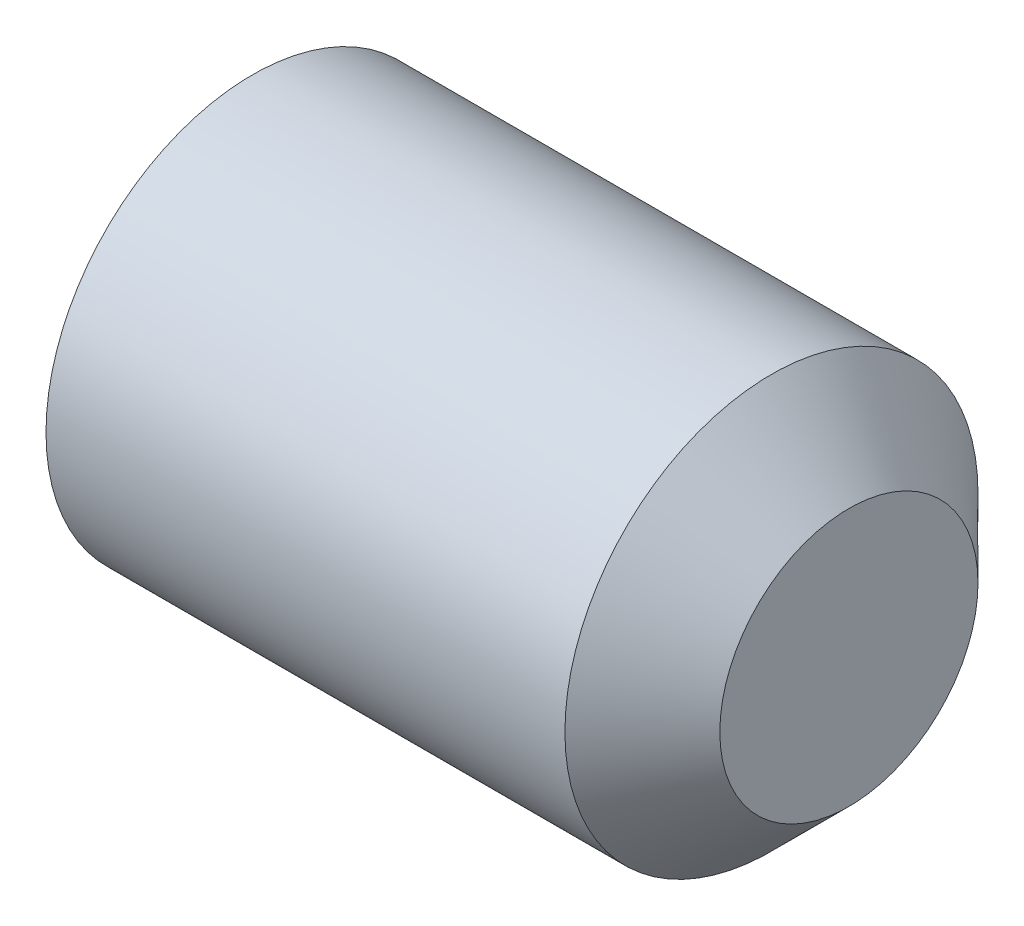
ISO-10303-21;
HEADER;
FILE_DESCRIPTION(('STEP AP214'),'2;1');
FILE_NAME('part.step','',(''),(''),'','','');
FILE_SCHEMA(('AUTOMOTIVE_DESIGN { 1 0 10303 214 1 1 1 1 }'));
ENDSEC;
DATA;
#1=APPLICATION_CONTEXT('core data for automotive mechanical design processes');
#2=APPLICATION_PROTOCOL_DEFINITION('international standard','automotive_design',2000,#1);
#3=PRODUCT_CONTEXT('',#1,'mechanical');
#4=PRODUCT('Part','Part','',(#3));
#5=PRODUCT_RELATED_PRODUCT_CATEGORY('part','',(#4));
#6=PRODUCT_DEFINITION_FORMATION('','',#4);
#7=PRODUCT_DEFINITION_CONTEXT('part definition',#1,'design');
#8=PRODUCT_DEFINITION('design','',#6,#7);
#9=PRODUCT_DEFINITION_SHAPE('','',#8);
#10=(LENGTH_UNIT() NAMED_UNIT(*) SI_UNIT(.MILLI.,.METRE.));
#11=(NAMED_UNIT(*) PLANE_ANGLE_UNIT() SI_UNIT($,.RADIAN.));
#12=(NAMED_UNIT(*) SI_UNIT($,.STERADIAN.) SOLID_ANGLE_UNIT());
#13=UNCERTAINTY_MEASURE_WITH_UNIT(LENGTH_MEASURE(1.E-05),#10,'distance_accuracy_value','');
#14=(GEOMETRIC_REPRESENTATION_CONTEXT(3) GLOBAL_UNCERTAINTY_ASSIGNED_CONTEXT((#13)) GLOBAL_UNIT_ASSIGNED_CONTEXT((#10,
#11,#12)) REPRESENTATION_CONTEXT('',''));
#15=CARTESIAN_POINT('',(0.,0.,0.));
#16=DIRECTION('',(0.,0.,1.));
#17=DIRECTION('',(1.,0.,0.));
#18=AXIS2_PLACEMENT_3D('',#15,#16,#17);
#19=CARTESIAN_POINT('',(0.,0.,0.));
#20=DIRECTION('',(-1.,0.,0.));
#21=DIRECTION('',(0.,0.,1.));
#22=AXIS2_PLACEMENT_3D('',#19,#20,#21);
#23=PLANE('',#22);
#24=CARTESIAN_POINT('',(0.,0.,0.));
#25=DIRECTION('',(-1.,0.,0.));
#26=DIRECTION('',(0.,0.,1.));
#27=AXIS2_PLACEMENT_3D('',#24,#25,#26);
#28=CIRCLE('',#27,1.61);
#29=CARTESIAN_POINT('',(0.,0.,1.61));
#30=VERTEX_POINT('',#29);
#31=EDGE_CURVE('E137',#30,#30,#28,.T.);
#32=ORIENTED_EDGE('',*,*,#31,.T.);
#33=EDGE_LOOP('',(#32));
#34=FACE_BOUND('',#33,.T.);
#35=DIRECTION('',(0.,0.,-1.));
#36=VECTOR('',#35,1.);
#37=CARTESIAN_POINT('',(0.,1.,0.577350269189623));
#38=LINE('',#37,#36);
#39=CARTESIAN_POINT('',(0.,1.,0.577350269189623));
#40=VERTEX_POINT('',#39);
#41=CARTESIAN_POINT('',(0.,1.,-0.577350269189628));
#42=VERTEX_POINT('',#41);
#43=EDGE_CURVE('E128',#40,#42,#38,.T.);
#44=ORIENTED_EDGE('',*,*,#43,.F.);
#45=DIRECTION('',(0.,-0.866025403784438,0.500000000000001));
#46=VECTOR('',#45,1.);
#47=CARTESIAN_POINT('',(0.,1.,0.577350269189623));
#48=LINE('',#47,#46);
#49=CARTESIAN_POINT('',(0.,0.,1.15470053837925));
#50=VERTEX_POINT('',#49);
#51=EDGE_CURVE('E50',#40,#50,#48,.T.);
#52=ORIENTED_EDGE('',*,*,#51,.T.);
#53=DIRECTION('',(0.,0.866025403784439,0.5));
#54=VECTOR('',#53,1.);
#55=CARTESIAN_POINT('',(0.,-0.999999999999996,0.577350269189624));
#56=LINE('',#55,#54);
#57=CARTESIAN_POINT('',(0.,-0.999999999999996,0.577350269189624));
#58=VERTEX_POINT('',#57);
#59=EDGE_CURVE('E119',#58,#50,#56,.T.);
#60=ORIENTED_EDGE('',*,*,#59,.F.);
#61=DIRECTION('',(0.,0.,-1.));
#62=VECTOR('',#61,1.);
#63=CARTESIAN_POINT('',(0.,-0.999999999999996,0.577350269189624));
#64=LINE('',#63,#62);
#65=CARTESIAN_POINT('',(0.,-0.999999999999996,-0.577350269189627));
#66=VERTEX_POINT('',#65);
#67=EDGE_CURVE('E122',#58,#66,#64,.T.);
#68=ORIENTED_EDGE('',*,*,#67,.T.);
#69=DIRECTION('',(0.,0.866025403784438,-0.500000000000001));
#70=VECTOR('',#69,1.);
#71=CARTESIAN_POINT('',(0.,-0.999999999999996,-0.577350269189627));
#72=LINE('',#71,#70);
#73=CARTESIAN_POINT('',(0.,0.,-1.15470053837925));
#74=VERTEX_POINT('',#73);
#75=EDGE_CURVE('E125',#66,#74,#72,.T.);
#76=ORIENTED_EDGE('',*,*,#75,.T.);
#77=DIRECTION('',(0.,-0.866025403784438,-0.5));
#78=VECTOR('',#77,1.);
#79=CARTESIAN_POINT('',(0.,1.,-0.577350269189628));
#80=LINE('',#79,#78);
#81=EDGE_CURVE('E108',#42,#74,#80,.T.);
#82=ORIENTED_EDGE('',*,*,#81,.F.);
#83=EDGE_LOOP('',(#44,#52,#60,#68,#76,#82));
#84=FACE_BOUND('',#83,.T.);
#85=ADVANCED_FACE('F35',(#34,#84),#23,.T.);
#86=CARTESIAN_POINT('',(6.,1.25,0.));
#87=DIRECTION('',(1.,0.,0.));
#88=DIRECTION('',(0.,0.,-1.));
#89=AXIS2_PLACEMENT_3D('',#86,#87,#88);
#90=PLANE('',#89);
#91=CARTESIAN_POINT('',(6.,0.,0.));
#92=DIRECTION('',(-1.,0.,0.));
#93=DIRECTION('',(0.,0.,1.));
#94=AXIS2_PLACEMENT_3D('',#91,#92,#93);
#95=CIRCLE('',#94,1.25);
#96=CARTESIAN_POINT('',(6.,0.,1.25));
#97=VERTEX_POINT('',#96);
#98=EDGE_CURVE('E11',#97,#97,#95,.T.);
#99=ORIENTED_EDGE('',*,*,#98,.F.);
#100=EDGE_LOOP('',(#99));
#101=FACE_BOUND('',#100,.T.);
#102=ADVANCED_FACE('F37',(#101),#90,.T.);
#103=CARTESIAN_POINT('',(5.25,0.,0.));
#104=DIRECTION('',(-1.,0.,0.));
#105=DIRECTION('',(0.,0.,1.));
#106=AXIS2_PLACEMENT_3D('',#103,#104,#105);
#107=CONICAL_SURFACE('',#106,2.,0.785398163397448);
#108=ORIENTED_EDGE('',*,*,#98,.T.);
#109=EDGE_LOOP('',(#108));
#110=FACE_BOUND('',#109,.T.);
#111=CARTESIAN_POINT('',(5.25,0.,0.));
#112=DIRECTION('',(-1.,0.,0.));
#113=DIRECTION('',(0.,0.,1.));
#114=AXIS2_PLACEMENT_3D('',#111,#112,#113);
#115=CIRCLE('',#114,2.);
#116=CARTESIAN_POINT('',(5.25,0.,2.));
#117=VERTEX_POINT('',#116);
#118=EDGE_CURVE('E43',#117,#117,#115,.T.);
#119=ORIENTED_EDGE('',*,*,#118,.F.);
#120=EDGE_LOOP('',(#119));
#121=FACE_BOUND('',#120,.T.);
#122=ADVANCED_FACE('F148',(#110,#121),#107,.T.);
#123=CARTESIAN_POINT('',(-12.7,0.,0.));
#124=DIRECTION('',(-1.,0.,0.));
#125=DIRECTION('',(0.,0.,1.));
#126=AXIS2_PLACEMENT_3D('',#123,#124,#125);
#127=CYLINDRICAL_SURFACE('',#126,2.);
#128=ORIENTED_EDGE('',*,*,#118,.T.);
#129=EDGE_LOOP('',(#128));
#130=FACE_BOUND('',#129,.T.);
#131=CARTESIAN_POINT('',(0.225166604983952,0.,0.));
#132=DIRECTION('',(-1.,0.,0.));
#133=DIRECTION('',(0.,0.,1.));
#134=AXIS2_PLACEMENT_3D('',#131,#132,#133);
#135=CIRCLE('',#134,2.);
#136=CARTESIAN_POINT('',(0.225166604983952,0.,2.));
#137=VERTEX_POINT('',#136);
#138=EDGE_CURVE('E140',#137,#137,#135,.T.);
#139=ORIENTED_EDGE('',*,*,#138,.F.);
#140=EDGE_LOOP('',(#139));
#141=FACE_BOUND('',#140,.T.);
#142=ADVANCED_FACE('F145',(#130,#141),#127,.T.);
#143=CARTESIAN_POINT('',(0.,0.,0.));
#144=DIRECTION('',(1.,0.,0.));
#145=DIRECTION('',(0.,0.,-1.));
#146=AXIS2_PLACEMENT_3D('',#143,#144,#145);
#147=CONICAL_SURFACE('',#146,1.61,1.0471975511966);
#148=ORIENTED_EDGE('',*,*,#138,.T.);
#149=EDGE_LOOP('',(#148));
#150=FACE_BOUND('',#149,.T.);
#151=ORIENTED_EDGE('',*,*,#31,.F.);
#152=EDGE_LOOP('',(#151));
#153=FACE_BOUND('',#152,.T.);
#154=ADVANCED_FACE('F155',(#150,#153),#147,.T.);
#155=CARTESIAN_POINT('',(2.5,1.,0.577350269189623));
#156=DIRECTION('',(0.,-0.500000000000001,-0.866025403784438));
#157=DIRECTION('',(0.,0.866025403784438,-0.500000000000001));
#158=AXIS2_PLACEMENT_3D('',#155,#156,#157);
#159=PLANE('',#158);
#160=ORIENTED_EDGE('',*,*,#51,.F.);
#161=DIRECTION('',(-1.,0.,0.));
#162=VECTOR('',#161,1.);
#163=CARTESIAN_POINT('',(2.5,1.,0.577350269189623));
#164=LINE('',#163,#162);
#165=CARTESIAN_POINT('',(2.5,1.,0.577350269189623));
#166=VERTEX_POINT('',#165);
#167=EDGE_CURVE('E55',#166,#40,#164,.T.);
#168=ORIENTED_EDGE('',*,*,#167,.F.);
#169=DIRECTION('',(0.,-0.866025403784438,0.500000000000001));
#170=VECTOR('',#169,1.);
#171=CARTESIAN_POINT('',(2.5,1.,0.577350269189623));
#172=LINE('',#171,#170);
#173=CARTESIAN_POINT('',(2.5,0.,1.15470053837925));
#174=VERTEX_POINT('',#173);
#175=EDGE_CURVE('E82',#166,#174,#172,.T.);
#176=ORIENTED_EDGE('',*,*,#175,.T.);
#177=DIRECTION('',(-1.,0.,0.));
#178=VECTOR('',#177,1.);
#179=CARTESIAN_POINT('',(2.5,0.,1.15470053837925));
#180=LINE('',#179,#178);
#181=EDGE_CURVE('E135',#174,#50,#180,.T.);
#182=ORIENTED_EDGE('',*,*,#181,.T.);
#183=EDGE_LOOP('',(#160,#168,#176,#182));
#184=FACE_BOUND('',#183,.T.);
#185=ADVANCED_FACE('F166',(#184),#159,.T.);
#186=CARTESIAN_POINT('',(2.5,-0.999999999999996,0.577350269189624));
#187=DIRECTION('',(0.,-0.5,0.866025403784439));
#188=DIRECTION('',(0.,-0.866025403784439,-0.5));
#189=AXIS2_PLACEMENT_3D('',#186,#187,#188);
#190=PLANE('',#189);
#191=ORIENTED_EDGE('',*,*,#59,.T.);
#192=ORIENTED_EDGE('',*,*,#181,.F.);
#193=DIRECTION('',(0.,0.866025403784439,0.5));
#194=VECTOR('',#193,1.);
#195=CARTESIAN_POINT('',(2.5,-0.999999999999996,0.577350269189624));
#196=LINE('',#195,#194);
#197=CARTESIAN_POINT('',(2.5,-0.999999999999996,0.577350269189624));
#198=VERTEX_POINT('',#197);
#199=EDGE_CURVE('E266',#198,#174,#196,.T.);
#200=ORIENTED_EDGE('',*,*,#199,.F.);
#201=DIRECTION('',(-1.,0.,0.));
#202=VECTOR('',#201,1.);
#203=CARTESIAN_POINT('',(2.5,-0.999999999999996,0.577350269189624));
#204=LINE('',#203,#202);
#205=EDGE_CURVE('E133',#198,#58,#204,.T.);
#206=ORIENTED_EDGE('',*,*,#205,.T.);
#207=EDGE_LOOP('',(#191,#192,#200,#206));
#208=FACE_BOUND('',#207,.T.);
#209=ADVANCED_FACE('F173',(#208),#190,.F.);
#210=CARTESIAN_POINT('',(2.5,-0.999999999999996,0.577350269189624));
#211=DIRECTION('',(0.,1.,0.));
#212=DIRECTION('',(0.,0.,1.));
#213=AXIS2_PLACEMENT_3D('',#210,#211,#212);
#214=PLANE('',#213);
#215=ORIENTED_EDGE('',*,*,#67,.F.);
#216=ORIENTED_EDGE('',*,*,#205,.F.);
#217=DIRECTION('',(0.,0.,-1.));
#218=VECTOR('',#217,1.);
#219=CARTESIAN_POINT('',(2.5,-0.999999999999996,0.577350269189624));
#220=LINE('',#219,#218);
#221=CARTESIAN_POINT('',(2.5,-0.999999999999996,-0.577350269189627));
#222=VERTEX_POINT('',#221);
#223=EDGE_CURVE('E103',#198,#222,#220,.T.);
#224=ORIENTED_EDGE('',*,*,#223,.T.);
#225=DIRECTION('',(-1.,0.,0.));
#226=VECTOR('',#225,1.);
#227=CARTESIAN_POINT('',(2.5,-0.999999999999996,-0.577350269189627));
#228=LINE('',#227,#226);
#229=EDGE_CURVE('E98',#222,#66,#228,.T.);
#230=ORIENTED_EDGE('',*,*,#229,.T.);
#231=EDGE_LOOP('',(#215,#216,#224,#230));
#232=FACE_BOUND('',#231,.T.);
#233=ADVANCED_FACE('F180',(#232),#214,.T.);
#234=CARTESIAN_POINT('',(2.5,-0.999999999999996,-0.577350269189627));
#235=DIRECTION('',(0.,0.500000000000001,0.866025403784438));
#236=DIRECTION('',(0.,-0.866025403784438,0.500000000000001));
#237=AXIS2_PLACEMENT_3D('',#234,#235,#236);
#238=PLANE('',#237);
#239=ORIENTED_EDGE('',*,*,#75,.F.);
#240=ORIENTED_EDGE('',*,*,#229,.F.);
#241=DIRECTION('',(0.,0.866025403784438,-0.500000000000001));
#242=VECTOR('',#241,1.);
#243=CARTESIAN_POINT('',(2.5,-0.999999999999996,-0.577350269189627));
#244=LINE('',#243,#242);
#245=CARTESIAN_POINT('',(2.5,0.,-1.15470053837925));
#246=VERTEX_POINT('',#245);
#247=EDGE_CURVE('E93',#222,#246,#244,.T.);
#248=ORIENTED_EDGE('',*,*,#247,.T.);
#249=DIRECTION('',(-1.,0.,0.));
#250=VECTOR('',#249,1.);
#251=CARTESIAN_POINT('',(2.5,0.,-1.15470053837925));
#252=LINE('',#251,#250);
#253=EDGE_CURVE('E97',#246,#74,#252,.T.);
#254=ORIENTED_EDGE('',*,*,#253,.T.);
#255=EDGE_LOOP('',(#239,#240,#248,#254));
#256=FACE_BOUND('',#255,.T.);
#257=ADVANCED_FACE('F96',(#256),#238,.T.);
#258=CARTESIAN_POINT('',(2.5,1.,-0.577350269189628));
#259=DIRECTION('',(0.,0.5,-0.866025403784439));
#260=DIRECTION('',(0.,0.866025403784439,0.5));
#261=AXIS2_PLACEMENT_3D('',#258,#259,#260);
#262=PLANE('',#261);
#263=ORIENTED_EDGE('',*,*,#81,.T.);
#264=ORIENTED_EDGE('',*,*,#253,.F.);
#265=DIRECTION('',(0.,-0.866025403784438,-0.5));
#266=VECTOR('',#265,1.);
#267=CARTESIAN_POINT('',(2.5,1.,-0.577350269189628));
#268=LINE('',#267,#266);
#269=CARTESIAN_POINT('',(2.5,1.,-0.577350269189628));
#270=VERTEX_POINT('',#269);
#271=EDGE_CURVE('E102',#270,#246,#268,.T.);
#272=ORIENTED_EDGE('',*,*,#271,.F.);
#273=DIRECTION('',(-1.,0.,0.));
#274=VECTOR('',#273,1.);
#275=CARTESIAN_POINT('',(2.5,1.,-0.577350269189628));
#276=LINE('',#275,#274);
#277=EDGE_CURVE('E78',#270,#42,#276,.T.);
#278=ORIENTED_EDGE('',*,*,#277,.T.);
#279=EDGE_LOOP('',(#263,#264,#272,#278));
#280=FACE_BOUND('',#279,.T.);
#281=ADVANCED_FACE('F105',(#280),#262,.F.);
#282=CARTESIAN_POINT('',(2.5,1.,0.577350269189623));
#283=DIRECTION('',(0.,1.,0.));
#284=DIRECTION('',(0.,0.,1.));
#285=AXIS2_PLACEMENT_3D('',#282,#283,#284);
#286=PLANE('',#285);
#287=ORIENTED_EDGE('',*,*,#43,.T.);
#288=ORIENTED_EDGE('',*,*,#277,.F.);
#289=DIRECTION('',(0.,0.,-1.));
#290=VECTOR('',#289,1.);
#291=CARTESIAN_POINT('',(2.5,1.,0.577350269189623));
#292=LINE('',#291,#290);
#293=EDGE_CURVE('E113',#166,#270,#292,.T.);
#294=ORIENTED_EDGE('',*,*,#293,.F.);
#295=ORIENTED_EDGE('',*,*,#167,.T.);
#296=EDGE_LOOP('',(#287,#288,#294,#295));
#297=FACE_BOUND('',#296,.T.);
#298=ADVANCED_FACE('F192',(#297),#286,.F.);
#299=CARTESIAN_POINT('',(2.5,2.,0.));
#300=DIRECTION('',(1.,0.,0.));
#301=DIRECTION('',(0.,0.,-1.));
#302=AXIS2_PLACEMENT_3D('',#299,#300,#301);
#303=PLANE('',#302);
#304=ORIENTED_EDGE('',*,*,#175,.F.);
#305=ORIENTED_EDGE('',*,*,#293,.T.);
#306=ORIENTED_EDGE('',*,*,#271,.T.);
#307=ORIENTED_EDGE('',*,*,#247,.F.);
#308=ORIENTED_EDGE('',*,*,#223,.F.);
#309=ORIENTED_EDGE('',*,*,#199,.T.);
#310=EDGE_LOOP('',(#304,#305,#306,#307,#308,#309));
#311=FACE_BOUND('',#310,.T.);
#312=ADVANCED_FACE('F111',(#311),#303,.F.);
#313=CLOSED_SHELL('',(#85,#102,#122,#142,#154,#185,#209,#233,#257,#281,#298,#312));
#314=MANIFOLD_SOLID_BREP('B2',#313);
#315=ADVANCED_BREP_SHAPE_REPRESENTATION('',(#18,#314),#14);
#316=SHAPE_DEFINITION_REPRESENTATION(#9,#315);
ENDSEC;
END-ISO-10303-21;
